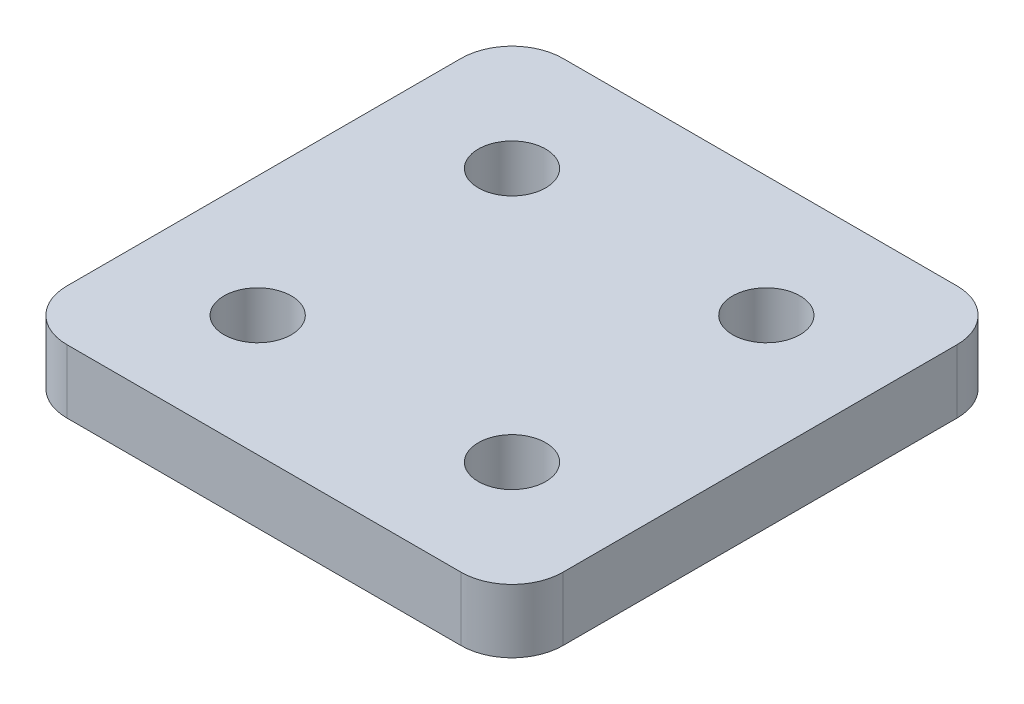
ISO-10303-21;
HEADER;
FILE_DESCRIPTION(('STEP AP214'),'2;1');
FILE_NAME('part.step','',(''),(''),'','','');
FILE_SCHEMA(('AUTOMOTIVE_DESIGN { 1 0 10303 214 1 1 1 1 }'));
ENDSEC;
DATA;
#1=APPLICATION_CONTEXT('core data for automotive mechanical design processes');
#2=APPLICATION_PROTOCOL_DEFINITION('international standard','automotive_design',2000,#1);
#3=PRODUCT_CONTEXT('',#1,'mechanical');
#4=PRODUCT('Part','Part','',(#3));
#5=PRODUCT_RELATED_PRODUCT_CATEGORY('part','',(#4));
#6=PRODUCT_DEFINITION_FORMATION('','',#4);
#7=PRODUCT_DEFINITION_CONTEXT('part definition',#1,'design');
#8=PRODUCT_DEFINITION('design','',#6,#7);
#9=PRODUCT_DEFINITION_SHAPE('','',#8);
#10=(LENGTH_UNIT() NAMED_UNIT(*) SI_UNIT(.MILLI.,.METRE.));
#11=(NAMED_UNIT(*) PLANE_ANGLE_UNIT() SI_UNIT($,.RADIAN.));
#12=(NAMED_UNIT(*) SI_UNIT($,.STERADIAN.) SOLID_ANGLE_UNIT());
#13=UNCERTAINTY_MEASURE_WITH_UNIT(LENGTH_MEASURE(1.E-05),#10,'distance_accuracy_value','');
#14=(GEOMETRIC_REPRESENTATION_CONTEXT(3) GLOBAL_UNCERTAINTY_ASSIGNED_CONTEXT((#13)) GLOBAL_UNIT_ASSIGNED_CONTEXT((#10,
#11,#12)) REPRESENTATION_CONTEXT('',''));
#15=CARTESIAN_POINT('',(0.,0.,0.));
#16=DIRECTION('',(0.,0.,1.));
#17=DIRECTION('',(1.,0.,0.));
#18=AXIS2_PLACEMENT_3D('',#15,#16,#17);
#19=CARTESIAN_POINT('',(-15.5,5.,15.5));
#20=DIRECTION('',(0.,1.,0.));
#21=DIRECTION('',(0.,0.,1.));
#22=AXIS2_PLACEMENT_3D('',#19,#20,#21);
#23=PLANE('',#22);
#24=CARTESIAN_POINT('',(-10.,5.,10.));
#25=DIRECTION('',(0.,1.,0.));
#26=DIRECTION('',(0.,0.,1.));
#27=AXIS2_PLACEMENT_3D('',#24,#25,#26);
#28=CIRCLE('',#27,2.65);
#29=CARTESIAN_POINT('',(-10.,5.,12.65));
#30=VERTEX_POINT('',#29);
#31=EDGE_CURVE('E190',#30,#30,#28,.T.);
#32=ORIENTED_EDGE('',*,*,#31,.F.);
#33=EDGE_LOOP('',(#32));
#34=FACE_BOUND('',#33,.T.);
#35=CARTESIAN_POINT('',(10.,5.,10.));
#36=DIRECTION('',(0.,1.,0.));
#37=DIRECTION('',(0.,0.,1.));
#38=AXIS2_PLACEMENT_3D('',#35,#36,#37);
#39=CIRCLE('',#38,2.65);
#40=CARTESIAN_POINT('',(10.,5.,12.65));
#41=VERTEX_POINT('',#40);
#42=EDGE_CURVE('E136',#41,#41,#39,.T.);
#43=ORIENTED_EDGE('',*,*,#42,.F.);
#44=EDGE_LOOP('',(#43));
#45=FACE_BOUND('',#44,.T.);
#46=CARTESIAN_POINT('',(-15.5,5.,15.5));
#47=DIRECTION('',(0.,1.,0.));
#48=DIRECTION('',(0.,0.,1.));
#49=AXIS2_PLACEMENT_3D('',#46,#47,#48);
#50=CIRCLE('',#49,4.);
#51=CARTESIAN_POINT('',(-19.5,5.,15.5));
#52=VERTEX_POINT('',#51);
#53=CARTESIAN_POINT('',(-15.5,5.,19.5));
#54=VERTEX_POINT('',#53);
#55=EDGE_CURVE('E147',#52,#54,#50,.T.);
#56=ORIENTED_EDGE('',*,*,#55,.T.);
#57=DIRECTION('',(1.,0.,0.));
#58=VECTOR('',#57,1.);
#59=CARTESIAN_POINT('',(-15.5,5.,19.5));
#60=LINE('',#59,#58);
#61=CARTESIAN_POINT('',(15.5,5.,19.5));
#62=VERTEX_POINT('',#61);
#63=EDGE_CURVE('E95',#54,#62,#60,.T.);
#64=ORIENTED_EDGE('',*,*,#63,.T.);
#65=CARTESIAN_POINT('',(15.5,5.,15.5));
#66=DIRECTION('',(0.,1.,0.));
#67=DIRECTION('',(0.,0.,-1.));
#68=AXIS2_PLACEMENT_3D('',#65,#66,#67);
#69=CIRCLE('',#68,4.);
#70=CARTESIAN_POINT('',(19.5,5.,15.5));
#71=VERTEX_POINT('',#70);
#72=EDGE_CURVE('E162',#62,#71,#69,.T.);
#73=ORIENTED_EDGE('',*,*,#72,.T.);
#74=DIRECTION('',(0.,0.,-1.));
#75=VECTOR('',#74,1.);
#76=CARTESIAN_POINT('',(19.5,5.,15.5));
#77=LINE('',#76,#75);
#78=CARTESIAN_POINT('',(19.5,5.,-15.5));
#79=VERTEX_POINT('',#78);
#80=EDGE_CURVE('E175',#71,#79,#77,.T.);
#81=ORIENTED_EDGE('',*,*,#80,.T.);
#82=CARTESIAN_POINT('',(15.5,5.,-15.5));
#83=DIRECTION('',(0.,1.,0.));
#84=DIRECTION('',(0.,0.,-1.));
#85=AXIS2_PLACEMENT_3D('',#82,#83,#84);
#86=CIRCLE('',#85,4.);
#87=CARTESIAN_POINT('',(15.5,5.,-19.5));
#88=VERTEX_POINT('',#87);
#89=EDGE_CURVE('E114',#79,#88,#86,.T.);
#90=ORIENTED_EDGE('',*,*,#89,.T.);
#91=DIRECTION('',(-1.,0.,0.));
#92=VECTOR('',#91,1.);
#93=CARTESIAN_POINT('',(-15.5,5.,-19.5));
#94=LINE('',#93,#92);
#95=CARTESIAN_POINT('',(-15.5,5.,-19.5));
#96=VERTEX_POINT('',#95);
#97=EDGE_CURVE('E108',#88,#96,#94,.T.);
#98=ORIENTED_EDGE('',*,*,#97,.T.);
#99=CARTESIAN_POINT('',(-15.5,5.,-15.5));
#100=DIRECTION('',(0.,1.,0.));
#101=DIRECTION('',(0.,0.,-1.));
#102=AXIS2_PLACEMENT_3D('',#99,#100,#101);
#103=CIRCLE('',#102,4.);
#104=CARTESIAN_POINT('',(-19.5,5.,-15.5));
#105=VERTEX_POINT('',#104);
#106=EDGE_CURVE('E112',#96,#105,#103,.T.);
#107=ORIENTED_EDGE('',*,*,#106,.T.);
#108=DIRECTION('',(0.,0.,1.));
#109=VECTOR('',#108,1.);
#110=CARTESIAN_POINT('',(-19.5,5.,15.5));
#111=LINE('',#110,#109);
#112=EDGE_CURVE('E52',#105,#52,#111,.T.);
#113=ORIENTED_EDGE('',*,*,#112,.T.);
#114=EDGE_LOOP('',(#56,#64,#73,#81,#90,#98,#107,#113));
#115=FACE_BOUND('',#114,.T.);
#116=CARTESIAN_POINT('',(10.,5.,-10.));
#117=DIRECTION('',(0.,1.,0.));
#118=DIRECTION('',(0.,0.,1.));
#119=AXIS2_PLACEMENT_3D('',#116,#117,#118);
#120=CIRCLE('',#119,2.65);
#121=CARTESIAN_POINT('',(10.,5.,-7.35));
#122=VERTEX_POINT('',#121);
#123=EDGE_CURVE('E184',#122,#122,#120,.T.);
#124=ORIENTED_EDGE('',*,*,#123,.F.);
#125=EDGE_LOOP('',(#124));
#126=FACE_BOUND('',#125,.T.);
#127=CARTESIAN_POINT('',(-10.,5.,-10.));
#128=DIRECTION('',(0.,1.,0.));
#129=DIRECTION('',(0.,0.,1.));
#130=AXIS2_PLACEMENT_3D('',#127,#128,#129);
#131=CIRCLE('',#130,2.65);
#132=CARTESIAN_POINT('',(-10.,5.,-7.35));
#133=VERTEX_POINT('',#132);
#134=EDGE_CURVE('E196',#133,#133,#131,.T.);
#135=ORIENTED_EDGE('',*,*,#134,.F.);
#136=EDGE_LOOP('',(#135));
#137=FACE_BOUND('',#136,.T.);
#138=ADVANCED_FACE('F35',(#34,#45,#115,#126,#137),#23,.T.);
#139=CARTESIAN_POINT('',(-15.5,0.,15.5));
#140=DIRECTION('',(0.,1.,0.));
#141=DIRECTION('',(0.,0.,1.));
#142=AXIS2_PLACEMENT_3D('',#139,#140,#141);
#143=PLANE('',#142);
#144=CARTESIAN_POINT('',(-15.5,0.,15.5));
#145=DIRECTION('',(0.,1.,0.));
#146=DIRECTION('',(0.,0.,1.));
#147=AXIS2_PLACEMENT_3D('',#144,#145,#146);
#148=CIRCLE('',#147,4.);
#149=CARTESIAN_POINT('',(-19.5,0.,15.5));
#150=VERTEX_POINT('',#149);
#151=CARTESIAN_POINT('',(-15.5,0.,19.5));
#152=VERTEX_POINT('',#151);
#153=EDGE_CURVE('E132',#150,#152,#148,.T.);
#154=ORIENTED_EDGE('',*,*,#153,.F.);
#155=DIRECTION('',(0.,0.,1.));
#156=VECTOR('',#155,1.);
#157=CARTESIAN_POINT('',(-19.5,0.,15.5));
#158=LINE('',#157,#156);
#159=CARTESIAN_POINT('',(-19.5,0.,-15.5));
#160=VERTEX_POINT('',#159);
#161=EDGE_CURVE('E87',#160,#150,#158,.T.);
#162=ORIENTED_EDGE('',*,*,#161,.F.);
#163=CARTESIAN_POINT('',(-15.5,0.,-15.5));
#164=DIRECTION('',(0.,1.,0.));
#165=DIRECTION('',(0.,0.,-1.));
#166=AXIS2_PLACEMENT_3D('',#163,#164,#165);
#167=CIRCLE('',#166,4.);
#168=CARTESIAN_POINT('',(-15.5,0.,-19.5));
#169=VERTEX_POINT('',#168);
#170=EDGE_CURVE('E81',#169,#160,#167,.T.);
#171=ORIENTED_EDGE('',*,*,#170,.F.);
#172=DIRECTION('',(-1.,0.,0.));
#173=VECTOR('',#172,1.);
#174=CARTESIAN_POINT('',(-15.5,0.,-19.5));
#175=LINE('',#174,#173);
#176=CARTESIAN_POINT('',(15.5,0.,-19.5));
#177=VERTEX_POINT('',#176);
#178=EDGE_CURVE('E122',#177,#169,#175,.T.);
#179=ORIENTED_EDGE('',*,*,#178,.F.);
#180=CARTESIAN_POINT('',(15.5,0.,-15.5));
#181=DIRECTION('',(0.,1.,0.));
#182=DIRECTION('',(0.,0.,-1.));
#183=AXIS2_PLACEMENT_3D('',#180,#181,#182);
#184=CIRCLE('',#183,4.);
#185=CARTESIAN_POINT('',(19.5,0.,-15.5));
#186=VERTEX_POINT('',#185);
#187=EDGE_CURVE('E142',#186,#177,#184,.T.);
#188=ORIENTED_EDGE('',*,*,#187,.F.);
#189=DIRECTION('',(0.,0.,-1.));
#190=VECTOR('',#189,1.);
#191=CARTESIAN_POINT('',(19.5,0.,15.5));
#192=LINE('',#191,#190);
#193=CARTESIAN_POINT('',(19.5,0.,15.5));
#194=VERTEX_POINT('',#193);
#195=EDGE_CURVE('E140',#194,#186,#192,.T.);
#196=ORIENTED_EDGE('',*,*,#195,.F.);
#197=CARTESIAN_POINT('',(15.5,0.,15.5));
#198=DIRECTION('',(0.,1.,0.));
#199=DIRECTION('',(0.,0.,-1.));
#200=AXIS2_PLACEMENT_3D('',#197,#198,#199);
#201=CIRCLE('',#200,4.);
#202=CARTESIAN_POINT('',(15.5,0.,19.5));
#203=VERTEX_POINT('',#202);
#204=EDGE_CURVE('E138',#203,#194,#201,.T.);
#205=ORIENTED_EDGE('',*,*,#204,.F.);
#206=DIRECTION('',(1.,0.,0.));
#207=VECTOR('',#206,1.);
#208=CARTESIAN_POINT('',(-15.5,0.,19.5));
#209=LINE('',#208,#207);
#210=EDGE_CURVE('E135',#152,#203,#209,.T.);
#211=ORIENTED_EDGE('',*,*,#210,.F.);
#212=EDGE_LOOP('',(#154,#162,#171,#179,#188,#196,#205,#211));
#213=FACE_BOUND('',#212,.T.);
#214=CARTESIAN_POINT('',(10.,0.,10.));
#215=DIRECTION('',(0.,1.,0.));
#216=DIRECTION('',(0.,0.,1.));
#217=AXIS2_PLACEMENT_3D('',#214,#215,#216);
#218=CIRCLE('',#217,2.65);
#219=CARTESIAN_POINT('',(10.,0.,12.65));
#220=VERTEX_POINT('',#219);
#221=EDGE_CURVE('E181',#220,#220,#218,.T.);
#222=ORIENTED_EDGE('',*,*,#221,.T.);
#223=EDGE_LOOP('',(#222));
#224=FACE_BOUND('',#223,.T.);
#225=CARTESIAN_POINT('',(10.,0.,-10.));
#226=DIRECTION('',(0.,1.,0.));
#227=DIRECTION('',(0.,0.,1.));
#228=AXIS2_PLACEMENT_3D('',#225,#226,#227);
#229=CIRCLE('',#228,2.65);
#230=CARTESIAN_POINT('',(10.,0.,-7.35));
#231=VERTEX_POINT('',#230);
#232=EDGE_CURVE('E187',#231,#231,#229,.T.);
#233=ORIENTED_EDGE('',*,*,#232,.T.);
#234=EDGE_LOOP('',(#233));
#235=FACE_BOUND('',#234,.T.);
#236=CARTESIAN_POINT('',(-10.,0.,10.));
#237=DIRECTION('',(0.,1.,0.));
#238=DIRECTION('',(0.,0.,1.));
#239=AXIS2_PLACEMENT_3D('',#236,#237,#238);
#240=CIRCLE('',#239,2.65);
#241=CARTESIAN_POINT('',(-10.,0.,12.65));
#242=VERTEX_POINT('',#241);
#243=EDGE_CURVE('E193',#242,#242,#240,.T.);
#244=ORIENTED_EDGE('',*,*,#243,.T.);
#245=EDGE_LOOP('',(#244));
#246=FACE_BOUND('',#245,.T.);
#247=CARTESIAN_POINT('',(-10.,0.,-10.));
#248=DIRECTION('',(0.,1.,0.));
#249=DIRECTION('',(0.,0.,1.));
#250=AXIS2_PLACEMENT_3D('',#247,#248,#249);
#251=CIRCLE('',#250,2.65);
#252=CARTESIAN_POINT('',(-10.,0.,-7.35));
#253=VERTEX_POINT('',#252);
#254=EDGE_CURVE('E199',#253,#253,#251,.T.);
#255=ORIENTED_EDGE('',*,*,#254,.T.);
#256=EDGE_LOOP('',(#255));
#257=FACE_BOUND('',#256,.T.);
#258=ADVANCED_FACE('F166',(#213,#224,#235,#246,#257),#143,.F.);
#259=CARTESIAN_POINT('',(-15.5,5.,15.5));
#260=DIRECTION('',(0.,-1.,0.));
#261=DIRECTION('',(0.,0.,-1.));
#262=AXIS2_PLACEMENT_3D('',#259,#260,#261);
#263=CYLINDRICAL_SURFACE('',#262,4.);
#264=ORIENTED_EDGE('',*,*,#153,.T.);
#265=DIRECTION('',(0.,-1.,0.));
#266=VECTOR('',#265,1.);
#267=CARTESIAN_POINT('',(-15.5,5.,19.5));
#268=LINE('',#267,#266);
#269=EDGE_CURVE('E11',#54,#152,#268,.T.);
#270=ORIENTED_EDGE('',*,*,#269,.F.);
#271=ORIENTED_EDGE('',*,*,#55,.F.);
#272=DIRECTION('',(0.,-1.,0.));
#273=VECTOR('',#272,1.);
#274=CARTESIAN_POINT('',(-19.5,5.,15.5));
#275=LINE('',#274,#273);
#276=EDGE_CURVE('E128',#52,#150,#275,.T.);
#277=ORIENTED_EDGE('',*,*,#276,.T.);
#278=EDGE_LOOP('',(#264,#270,#271,#277));
#279=FACE_BOUND('',#278,.T.);
#280=ADVANCED_FACE('F37',(#279),#263,.T.);
#281=CARTESIAN_POINT('',(-15.5,5.,19.5));
#282=DIRECTION('',(0.,0.,-1.));
#283=DIRECTION('',(-1.,0.,0.));
#284=AXIS2_PLACEMENT_3D('',#281,#282,#283);
#285=PLANE('',#284);
#286=ORIENTED_EDGE('',*,*,#210,.T.);
#287=DIRECTION('',(0.,-1.,0.));
#288=VECTOR('',#287,1.);
#289=CARTESIAN_POINT('',(15.5,5.,19.5));
#290=LINE('',#289,#288);
#291=EDGE_CURVE('E44',#62,#203,#290,.T.);
#292=ORIENTED_EDGE('',*,*,#291,.F.);
#293=ORIENTED_EDGE('',*,*,#63,.F.);
#294=ORIENTED_EDGE('',*,*,#269,.T.);
#295=EDGE_LOOP('',(#286,#292,#293,#294));
#296=FACE_BOUND('',#295,.T.);
#297=ADVANCED_FACE('F233',(#296),#285,.F.);
#298=CARTESIAN_POINT('',(15.5,5.,15.5));
#299=DIRECTION('',(0.,-1.,0.));
#300=DIRECTION('',(0.,0.,-1.));
#301=AXIS2_PLACEMENT_3D('',#298,#299,#300);
#302=CYLINDRICAL_SURFACE('',#301,4.);
#303=ORIENTED_EDGE('',*,*,#204,.T.);
#304=DIRECTION('',(0.,-1.,0.));
#305=VECTOR('',#304,1.);
#306=CARTESIAN_POINT('',(19.5,5.,15.5));
#307=LINE('',#306,#305);
#308=EDGE_CURVE('E154',#71,#194,#307,.T.);
#309=ORIENTED_EDGE('',*,*,#308,.F.);
#310=ORIENTED_EDGE('',*,*,#72,.F.);
#311=ORIENTED_EDGE('',*,*,#291,.T.);
#312=EDGE_LOOP('',(#303,#309,#310,#311));
#313=FACE_BOUND('',#312,.T.);
#314=ADVANCED_FACE('F160',(#313),#302,.T.);
#315=CARTESIAN_POINT('',(19.5,5.,15.5));
#316=DIRECTION('',(-1.,0.,0.));
#317=DIRECTION('',(0.,0.,1.));
#318=AXIS2_PLACEMENT_3D('',#315,#316,#317);
#319=PLANE('',#318);
#320=ORIENTED_EDGE('',*,*,#195,.T.);
#321=DIRECTION('',(0.,-1.,0.));
#322=VECTOR('',#321,1.);
#323=CARTESIAN_POINT('',(19.5,5.,-15.5));
#324=LINE('',#323,#322);
#325=EDGE_CURVE('E151',#79,#186,#324,.T.);
#326=ORIENTED_EDGE('',*,*,#325,.F.);
#327=ORIENTED_EDGE('',*,*,#80,.F.);
#328=ORIENTED_EDGE('',*,*,#308,.T.);
#329=EDGE_LOOP('',(#320,#326,#327,#328));
#330=FACE_BOUND('',#329,.T.);
#331=ADVANCED_FACE('F171',(#330),#319,.F.);
#332=CARTESIAN_POINT('',(15.5,5.,-15.5));
#333=DIRECTION('',(0.,-1.,0.));
#334=DIRECTION('',(0.,0.,-1.));
#335=AXIS2_PLACEMENT_3D('',#332,#333,#334);
#336=CYLINDRICAL_SURFACE('',#335,4.);
#337=ORIENTED_EDGE('',*,*,#187,.T.);
#338=DIRECTION('',(0.,-1.,0.));
#339=VECTOR('',#338,1.);
#340=CARTESIAN_POINT('',(15.5,5.,-19.5));
#341=LINE('',#340,#339);
#342=EDGE_CURVE('E123',#88,#177,#341,.T.);
#343=ORIENTED_EDGE('',*,*,#342,.F.);
#344=ORIENTED_EDGE('',*,*,#89,.F.);
#345=ORIENTED_EDGE('',*,*,#325,.T.);
#346=EDGE_LOOP('',(#337,#343,#344,#345));
#347=FACE_BOUND('',#346,.T.);
#348=ADVANCED_FACE('F174',(#347),#336,.T.);
#349=CARTESIAN_POINT('',(-15.5,5.,-19.5));
#350=DIRECTION('',(0.,0.,1.));
#351=DIRECTION('',(1.,0.,0.));
#352=AXIS2_PLACEMENT_3D('',#349,#350,#351);
#353=PLANE('',#352);
#354=ORIENTED_EDGE('',*,*,#178,.T.);
#355=DIRECTION('',(0.,-1.,0.));
#356=VECTOR('',#355,1.);
#357=CARTESIAN_POINT('',(-15.5,5.,-19.5));
#358=LINE('',#357,#356);
#359=EDGE_CURVE('E119',#96,#169,#358,.T.);
#360=ORIENTED_EDGE('',*,*,#359,.F.);
#361=ORIENTED_EDGE('',*,*,#97,.F.);
#362=ORIENTED_EDGE('',*,*,#342,.T.);
#363=EDGE_LOOP('',(#354,#360,#361,#362));
#364=FACE_BOUND('',#363,.T.);
#365=ADVANCED_FACE('F120',(#364),#353,.F.);
#366=CARTESIAN_POINT('',(-15.5,5.,-15.5));
#367=DIRECTION('',(0.,-1.,0.));
#368=DIRECTION('',(0.,0.,-1.));
#369=AXIS2_PLACEMENT_3D('',#366,#367,#368);
#370=CYLINDRICAL_SURFACE('',#369,4.);
#371=ORIENTED_EDGE('',*,*,#170,.T.);
#372=DIRECTION('',(0.,-1.,0.));
#373=VECTOR('',#372,1.);
#374=CARTESIAN_POINT('',(-19.5,5.,-15.5));
#375=LINE('',#374,#373);
#376=EDGE_CURVE('E124',#105,#160,#375,.T.);
#377=ORIENTED_EDGE('',*,*,#376,.F.);
#378=ORIENTED_EDGE('',*,*,#106,.F.);
#379=ORIENTED_EDGE('',*,*,#359,.T.);
#380=EDGE_LOOP('',(#371,#377,#378,#379));
#381=FACE_BOUND('',#380,.T.);
#382=ADVANCED_FACE('F126',(#381),#370,.T.);
#383=CARTESIAN_POINT('',(-19.5,5.,15.5));
#384=DIRECTION('',(1.,0.,0.));
#385=DIRECTION('',(0.,0.,-1.));
#386=AXIS2_PLACEMENT_3D('',#383,#384,#385);
#387=PLANE('',#386);
#388=ORIENTED_EDGE('',*,*,#161,.T.);
#389=ORIENTED_EDGE('',*,*,#276,.F.);
#390=ORIENTED_EDGE('',*,*,#112,.F.);
#391=ORIENTED_EDGE('',*,*,#376,.T.);
#392=EDGE_LOOP('',(#388,#389,#390,#391));
#393=FACE_BOUND('',#392,.T.);
#394=ADVANCED_FACE('F221',(#393),#387,.F.);
#395=CARTESIAN_POINT('',(10.,5.,10.));
#396=DIRECTION('',(0.,-1.,0.));
#397=DIRECTION('',(0.,0.,-1.));
#398=AXIS2_PLACEMENT_3D('',#395,#396,#397);
#399=CYLINDRICAL_SURFACE('',#398,2.65);
#400=ORIENTED_EDGE('',*,*,#42,.T.);
#401=EDGE_LOOP('',(#400));
#402=FACE_BOUND('',#401,.T.);
#403=ORIENTED_EDGE('',*,*,#221,.F.);
#404=EDGE_LOOP('',(#403));
#405=FACE_BOUND('',#404,.T.);
#406=ADVANCED_FACE('F218',(#402,#405),#399,.F.);
#407=CARTESIAN_POINT('',(10.,5.,-10.));
#408=DIRECTION('',(0.,-1.,0.));
#409=DIRECTION('',(0.,0.,-1.));
#410=AXIS2_PLACEMENT_3D('',#407,#408,#409);
#411=CYLINDRICAL_SURFACE('',#410,2.65);
#412=ORIENTED_EDGE('',*,*,#123,.T.);
#413=EDGE_LOOP('',(#412));
#414=FACE_BOUND('',#413,.T.);
#415=ORIENTED_EDGE('',*,*,#232,.F.);
#416=EDGE_LOOP('',(#415));
#417=FACE_BOUND('',#416,.T.);
#418=ADVANCED_FACE('F297',(#414,#417),#411,.F.);
#419=CARTESIAN_POINT('',(-10.,5.,10.));
#420=DIRECTION('',(0.,-1.,0.));
#421=DIRECTION('',(0.,0.,-1.));
#422=AXIS2_PLACEMENT_3D('',#419,#420,#421);
#423=CYLINDRICAL_SURFACE('',#422,2.65);
#424=ORIENTED_EDGE('',*,*,#31,.T.);
#425=EDGE_LOOP('',(#424));
#426=FACE_BOUND('',#425,.T.);
#427=ORIENTED_EDGE('',*,*,#243,.F.);
#428=EDGE_LOOP('',(#427));
#429=FACE_BOUND('',#428,.T.);
#430=ADVANCED_FACE('F305',(#426,#429),#423,.F.);
#431=CARTESIAN_POINT('',(-10.,5.,-10.));
#432=DIRECTION('',(0.,-1.,0.));
#433=DIRECTION('',(0.,0.,-1.));
#434=AXIS2_PLACEMENT_3D('',#431,#432,#433);
#435=CYLINDRICAL_SURFACE('',#434,2.65);
#436=ORIENTED_EDGE('',*,*,#134,.T.);
#437=EDGE_LOOP('',(#436));
#438=FACE_BOUND('',#437,.T.);
#439=ORIENTED_EDGE('',*,*,#254,.F.);
#440=EDGE_LOOP('',(#439));
#441=FACE_BOUND('',#440,.T.);
#442=ADVANCED_FACE('F205',(#438,#441),#435,.F.);
#443=CLOSED_SHELL('',(#138,#258,#280,#297,#314,#331,#348,#365,#382,#394,#406,#418,#430,#442));
#444=MANIFOLD_SOLID_BREP('B2',#443);
#445=ADVANCED_BREP_SHAPE_REPRESENTATION('',(#18,#444),#14);
#446=SHAPE_DEFINITION_REPRESENTATION(#9,#445);
ENDSEC;
END-ISO-10303-21;
